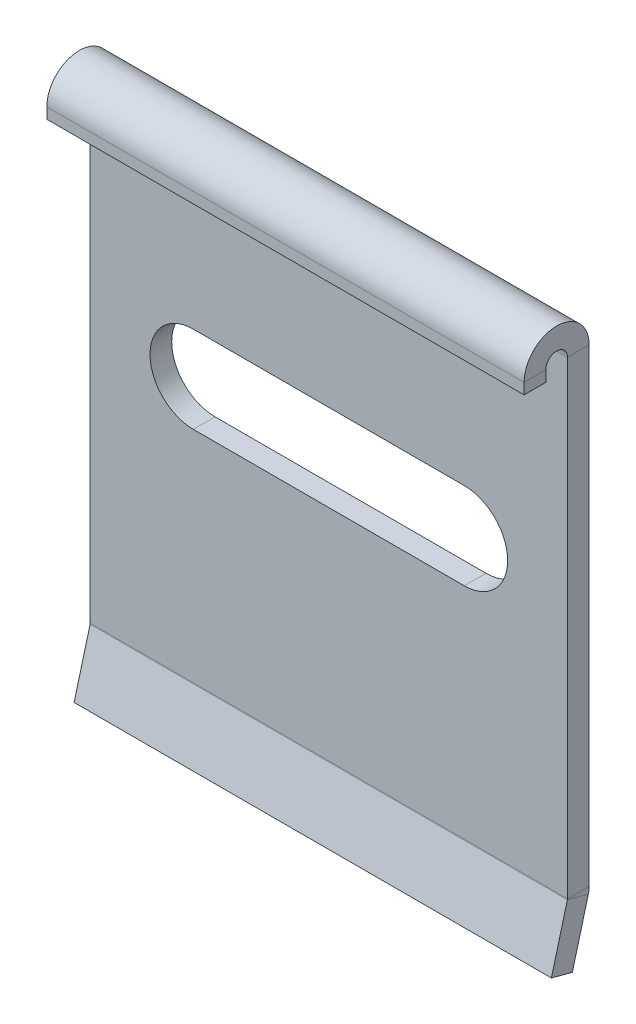
ISO-10303-21;
HEADER;
FILE_DESCRIPTION(('STEP AP214'),'2;1');
FILE_NAME('part.step','',(''),(''),'','','');
FILE_SCHEMA(('AUTOMOTIVE_DESIGN { 1 0 10303 214 1 1 1 1 }'));
ENDSEC;
DATA;
#1=APPLICATION_CONTEXT('core data for automotive mechanical design processes');
#2=APPLICATION_PROTOCOL_DEFINITION('international standard','automotive_design',2000,#1);
#3=PRODUCT_CONTEXT('',#1,'mechanical');
#4=PRODUCT('Part','Part','',(#3));
#5=PRODUCT_RELATED_PRODUCT_CATEGORY('part','',(#4));
#6=PRODUCT_DEFINITION_FORMATION('','',#4);
#7=PRODUCT_DEFINITION_CONTEXT('part definition',#1,'design');
#8=PRODUCT_DEFINITION('design','',#6,#7);
#9=PRODUCT_DEFINITION_SHAPE('','',#8);
#10=(LENGTH_UNIT() NAMED_UNIT(*) SI_UNIT(.MILLI.,.METRE.));
#11=(NAMED_UNIT(*) PLANE_ANGLE_UNIT() SI_UNIT($,.RADIAN.));
#12=(NAMED_UNIT(*) SI_UNIT($,.STERADIAN.) SOLID_ANGLE_UNIT());
#13=UNCERTAINTY_MEASURE_WITH_UNIT(LENGTH_MEASURE(1.E-05),#10,'distance_accuracy_value','');
#14=(GEOMETRIC_REPRESENTATION_CONTEXT(3) GLOBAL_UNCERTAINTY_ASSIGNED_CONTEXT((#13)) GLOBAL_UNIT_ASSIGNED_CONTEXT((#10,
#11,#12)) REPRESENTATION_CONTEXT('',''));
#15=CARTESIAN_POINT('',(0.,0.,0.));
#16=DIRECTION('',(0.,0.,1.));
#17=DIRECTION('',(1.,0.,0.));
#18=AXIS2_PLACEMENT_3D('',#15,#16,#17);
#19=CARTESIAN_POINT('',(33.3633633633633,45.4954954954955,-5.));
#20=DIRECTION('',(1.,0.,0.));
#21=DIRECTION('',(0.,1.,0.));
#22=AXIS2_PLACEMENT_3D('',#19,#20,#21);
#23=PLANE('',#22);
#24=DIRECTION('',(0.,1.,0.));
#25=VECTOR('',#24,1.);
#26=CARTESIAN_POINT('',(33.3633633633633,45.4954954954955,0.));
#27=LINE('',#26,#25);
#28=CARTESIAN_POINT('',(33.3633633633633,-70.0890127489998,0.));
#29=VERTEX_POINT('',#28);
#30=CARTESIAN_POINT('',(33.3633633633633,37.9954954954955,0.));
#31=VERTEX_POINT('',#30);
#32=EDGE_CURVE('E315',#29,#31,#27,.T.);
#33=ORIENTED_EDGE('',*,*,#32,.F.);
#34=DIRECTION('',(0.,0.,-1.));
#35=VECTOR('',#34,1.);
#36=CARTESIAN_POINT('',(33.3633633633633,-70.0890127489998,0.));
#37=LINE('',#36,#35);
#38=CARTESIAN_POINT('',(33.3633633633633,-70.0890127489998,-4.99999999999999));
#39=VERTEX_POINT('',#38);
#40=EDGE_CURVE('E225',#29,#39,#37,.T.);
#41=ORIENTED_EDGE('',*,*,#40,.T.);
#42=DIRECTION('',(0.,1.,0.));
#43=VECTOR('',#42,1.);
#44=CARTESIAN_POINT('',(33.3633633633633,45.4954954954955,-5.));
#45=LINE('',#44,#43);
#46=CARTESIAN_POINT('',(33.3633633633633,37.9954954954955,-5.));
#47=VERTEX_POINT('',#46);
#48=EDGE_CURVE('E64',#39,#47,#45,.T.);
#49=ORIENTED_EDGE('',*,*,#48,.T.);
#50=DIRECTION('',(0.,0.,-1.));
#51=VECTOR('',#50,1.);
#52=CARTESIAN_POINT('',(33.3633633633633,37.9954954954955,0.));
#53=LINE('',#52,#51);
#54=EDGE_CURVE('E251',#31,#47,#53,.T.);
#55=ORIENTED_EDGE('',*,*,#54,.F.);
#56=EDGE_LOOP('',(#33,#41,#49,#55));
#57=FACE_BOUND('',#56,.T.);
#58=ADVANCED_FACE('F56',(#57),#23,.T.);
#59=CARTESIAN_POINT('',(0.,0.,-5.));
#60=DIRECTION('',(0.,0.,-1.));
#61=DIRECTION('',(-1.,0.,0.));
#62=AXIS2_PLACEMENT_3D('',#59,#60,#61);
#63=PLANE('',#62);
#64=CARTESIAN_POINT('',(9.57957957957955,-9.5045045045045,-5.));
#65=DIRECTION('',(0.,0.,1.));
#66=DIRECTION('',(1.,0.,0.));
#67=AXIS2_PLACEMENT_3D('',#64,#65,#66);
#68=CIRCLE('',#67,9.99999999999999);
#69=CARTESIAN_POINT('',(9.57957957957956,-19.5045045045045,-5.));
#70=VERTEX_POINT('',#69);
#71=CARTESIAN_POINT('',(9.57957957957955,0.49549549549549,-5.));
#72=VERTEX_POINT('',#71);
#73=EDGE_CURVE('E290',#70,#72,#68,.T.);
#74=ORIENTED_EDGE('',*,*,#73,.T.);
#75=DIRECTION('',(-1.,0.,0.));
#76=VECTOR('',#75,1.);
#77=CARTESIAN_POINT('',(9.57957957957955,0.49549549549549,-5.));
#78=LINE('',#77,#76);
#79=CARTESIAN_POINT('',(-52.8528528528529,0.49549549549549,-5.));
#80=VERTEX_POINT('',#79);
#81=EDGE_CURVE('E293',#72,#80,#78,.T.);
#82=ORIENTED_EDGE('',*,*,#81,.T.);
#83=CARTESIAN_POINT('',(-52.8528528528529,-9.50450450450452,-5.));
#84=DIRECTION('',(0.,0.,1.));
#85=DIRECTION('',(1.,0.,0.));
#86=AXIS2_PLACEMENT_3D('',#83,#84,#85);
#87=CIRCLE('',#86,10.);
#88=CARTESIAN_POINT('',(-52.8528528528529,-19.5045045045045,-5.));
#89=VERTEX_POINT('',#88);
#90=EDGE_CURVE('E297',#80,#89,#87,.T.);
#91=ORIENTED_EDGE('',*,*,#90,.T.);
#92=DIRECTION('',(1.,0.,0.));
#93=VECTOR('',#92,1.);
#94=CARTESIAN_POINT('',(9.57957957957956,-19.5045045045045,-5.));
#95=LINE('',#94,#93);
#96=EDGE_CURVE('E300',#89,#70,#95,.T.);
#97=ORIENTED_EDGE('',*,*,#96,.T.);
#98=EDGE_LOOP('',(#74,#82,#91,#97));
#99=FACE_BOUND('',#98,.T.);
#100=ORIENTED_EDGE('',*,*,#48,.F.);
#101=DIRECTION('',(1.,0.,0.));
#102=VECTOR('',#101,1.);
#103=CARTESIAN_POINT('',(33.3633633633633,-70.0890127489998,-4.99999999999999));
#104=LINE('',#103,#102);
#105=CARTESIAN_POINT('',(-76.6366366366367,-70.0890127489998,-5.));
#106=VERTEX_POINT('',#105);
#107=EDGE_CURVE('E176',#39,#106,#104,.F.);
#108=ORIENTED_EDGE('',*,*,#107,.T.);
#109=DIRECTION('',(0.,-1.,0.));
#110=VECTOR('',#109,1.);
#111=CARTESIAN_POINT('',(-76.6366366366367,45.4954954954955,-5.));
#112=LINE('',#111,#110);
#113=CARTESIAN_POINT('',(-76.6366366366367,37.9954954954955,-5.));
#114=VERTEX_POINT('',#113);
#115=EDGE_CURVE('E13',#114,#106,#112,.T.);
#116=ORIENTED_EDGE('',*,*,#115,.F.);
#117=DIRECTION('',(-1.,0.,0.));
#118=VECTOR('',#117,1.);
#119=CARTESIAN_POINT('',(-76.6366366366367,37.9954954954955,-5.));
#120=LINE('',#119,#118);
#121=EDGE_CURVE('E235',#114,#47,#120,.F.);
#122=ORIENTED_EDGE('',*,*,#121,.T.);
#123=EDGE_LOOP('',(#100,#108,#116,#122));
#124=FACE_BOUND('',#123,.T.);
#125=ADVANCED_FACE('F338',(#99,#124),#63,.T.);
#126=CARTESIAN_POINT('',(0.,0.,0.));
#127=DIRECTION('',(0.,0.,-1.));
#128=DIRECTION('',(-1.,0.,0.));
#129=AXIS2_PLACEMENT_3D('',#126,#127,#128);
#130=PLANE('',#129);
#131=DIRECTION('',(-1.,0.,0.));
#132=VECTOR('',#131,1.);
#133=CARTESIAN_POINT('',(9.57957957957955,0.49549549549549,0.));
#134=LINE('',#133,#132);
#135=CARTESIAN_POINT('',(9.57957957957955,0.49549549549549,0.));
#136=VERTEX_POINT('',#135);
#137=CARTESIAN_POINT('',(-52.8528528528529,0.495495495495485,0.));
#138=VERTEX_POINT('',#137);
#139=EDGE_CURVE('E305',#136,#138,#134,.T.);
#140=ORIENTED_EDGE('',*,*,#139,.F.);
#141=CARTESIAN_POINT('',(9.57957957957955,-9.5045045045045,0.));
#142=DIRECTION('',(0.,0.,1.));
#143=DIRECTION('',(1.,0.,0.));
#144=AXIS2_PLACEMENT_3D('',#141,#142,#143);
#145=CIRCLE('',#144,9.99999999999999);
#146=CARTESIAN_POINT('',(9.57957957957956,-19.5045045045045,0.));
#147=VERTEX_POINT('',#146);
#148=EDGE_CURVE('E288',#147,#136,#145,.T.);
#149=ORIENTED_EDGE('',*,*,#148,.F.);
#150=DIRECTION('',(1.,0.,0.));
#151=VECTOR('',#150,1.);
#152=CARTESIAN_POINT('',(9.57957957957956,-19.5045045045045,0.));
#153=LINE('',#152,#151);
#154=CARTESIAN_POINT('',(-52.8528528528529,-19.5045045045045,0.));
#155=VERTEX_POINT('',#154);
#156=EDGE_CURVE('E294',#155,#147,#153,.T.);
#157=ORIENTED_EDGE('',*,*,#156,.F.);
#158=CARTESIAN_POINT('',(-52.8528528528529,-9.50450450450452,0.));
#159=DIRECTION('',(0.,0.,1.));
#160=DIRECTION('',(1.,0.,0.));
#161=AXIS2_PLACEMENT_3D('',#158,#159,#160);
#162=CIRCLE('',#161,10.);
#163=EDGE_CURVE('E308',#138,#155,#162,.T.);
#164=ORIENTED_EDGE('',*,*,#163,.F.);
#165=EDGE_LOOP('',(#140,#149,#157,#164));
#166=FACE_BOUND('',#165,.T.);
#167=DIRECTION('',(1.,0.,0.));
#168=VECTOR('',#167,1.);
#169=CARTESIAN_POINT('',(33.3633633633633,-70.0890127489998,0.));
#170=LINE('',#169,#168);
#171=CARTESIAN_POINT('',(-76.6366366366367,-70.0890127489998,0.));
#172=VERTEX_POINT('',#171);
#173=EDGE_CURVE('E229',#29,#172,#170,.F.);
#174=ORIENTED_EDGE('',*,*,#173,.F.);
#175=ORIENTED_EDGE('',*,*,#32,.T.);
#176=DIRECTION('',(-1.,0.,0.));
#177=VECTOR('',#176,1.);
#178=CARTESIAN_POINT('',(-76.6366366366367,37.9954954954955,0.));
#179=LINE('',#178,#177);
#180=CARTESIAN_POINT('',(-76.6366366366367,37.9954954954955,0.));
#181=VERTEX_POINT('',#180);
#182=EDGE_CURVE('E248',#181,#31,#179,.F.);
#183=ORIENTED_EDGE('',*,*,#182,.F.);
#184=DIRECTION('',(0.,-1.,0.));
#185=VECTOR('',#184,1.);
#186=CARTESIAN_POINT('',(-76.6366366366367,45.4954954954955,0.));
#187=LINE('',#186,#185);
#188=EDGE_CURVE('E59',#181,#172,#187,.T.);
#189=ORIENTED_EDGE('',*,*,#188,.T.);
#190=EDGE_LOOP('',(#174,#175,#183,#189));
#191=FACE_BOUND('',#190,.T.);
#192=ADVANCED_FACE('F329',(#166,#191),#130,.F.);
#193=CARTESIAN_POINT('',(-76.6366366366367,45.4954954954955,-5.));
#194=DIRECTION('',(-1.,0.,0.));
#195=DIRECTION('',(0.,-1.,0.));
#196=AXIS2_PLACEMENT_3D('',#193,#194,#195);
#197=PLANE('',#196);
#198=DIRECTION('',(0.,0.,-1.));
#199=VECTOR('',#198,1.);
#200=CARTESIAN_POINT('',(-76.6366366366367,-70.0890127489998,0.));
#201=LINE('',#200,#199);
#202=EDGE_CURVE('E232',#172,#106,#201,.T.);
#203=ORIENTED_EDGE('',*,*,#202,.F.);
#204=ORIENTED_EDGE('',*,*,#188,.F.);
#205=DIRECTION('',(0.,0.,-1.));
#206=VECTOR('',#205,1.);
#207=CARTESIAN_POINT('',(-76.6366366366367,37.9954954954955,0.));
#208=LINE('',#207,#206);
#209=EDGE_CURVE('E242',#181,#114,#208,.T.);
#210=ORIENTED_EDGE('',*,*,#209,.T.);
#211=ORIENTED_EDGE('',*,*,#115,.T.);
#212=EDGE_LOOP('',(#203,#204,#210,#211));
#213=FACE_BOUND('',#212,.T.);
#214=ADVANCED_FACE('F331',(#213),#197,.T.);
#215=CARTESIAN_POINT('',(9.57957957957955,-9.5045045045045,-5.));
#216=DIRECTION('',(0.,0.,1.));
#217=DIRECTION('',(1.,0.,0.));
#218=AXIS2_PLACEMENT_3D('',#215,#216,#217);
#219=CYLINDRICAL_SURFACE('',#218,9.99999999999999);
#220=ORIENTED_EDGE('',*,*,#148,.T.);
#221=DIRECTION('',(0.,0.,1.));
#222=VECTOR('',#221,1.);
#223=CARTESIAN_POINT('',(9.57957957957955,0.49549549549549,-5.));
#224=LINE('',#223,#222);
#225=EDGE_CURVE('E303',#72,#136,#224,.T.);
#226=ORIENTED_EDGE('',*,*,#225,.F.);
#227=ORIENTED_EDGE('',*,*,#73,.F.);
#228=DIRECTION('',(0.,0.,1.));
#229=VECTOR('',#228,1.);
#230=CARTESIAN_POINT('',(9.57957957957956,-19.5045045045045,-5.));
#231=LINE('',#230,#229);
#232=EDGE_CURVE('E313',#70,#147,#231,.T.);
#233=ORIENTED_EDGE('',*,*,#232,.T.);
#234=EDGE_LOOP('',(#220,#226,#227,#233));
#235=FACE_BOUND('',#234,.T.);
#236=ADVANCED_FACE('F381',(#235),#219,.F.);
#237=CARTESIAN_POINT('',(9.57957957957956,-19.5045045045045,-5.));
#238=DIRECTION('',(0.,-1.,0.));
#239=DIRECTION('',(1.,0.,0.));
#240=AXIS2_PLACEMENT_3D('',#237,#238,#239);
#241=PLANE('',#240);
#242=ORIENTED_EDGE('',*,*,#156,.T.);
#243=ORIENTED_EDGE('',*,*,#232,.F.);
#244=ORIENTED_EDGE('',*,*,#96,.F.);
#245=DIRECTION('',(0.,0.,1.));
#246=VECTOR('',#245,1.);
#247=CARTESIAN_POINT('',(-52.8528528528529,-19.5045045045045,-5.));
#248=LINE('',#247,#246);
#249=EDGE_CURVE('E316',#89,#155,#248,.T.);
#250=ORIENTED_EDGE('',*,*,#249,.T.);
#251=EDGE_LOOP('',(#242,#243,#244,#250));
#252=FACE_BOUND('',#251,.T.);
#253=ADVANCED_FACE('F387',(#252),#241,.F.);
#254=CARTESIAN_POINT('',(-52.8528528528529,-9.50450450450452,-5.));
#255=DIRECTION('',(0.,0.,1.));
#256=DIRECTION('',(1.,0.,0.));
#257=AXIS2_PLACEMENT_3D('',#254,#255,#256);
#258=CYLINDRICAL_SURFACE('',#257,10.);
#259=ORIENTED_EDGE('',*,*,#163,.T.);
#260=ORIENTED_EDGE('',*,*,#249,.F.);
#261=ORIENTED_EDGE('',*,*,#90,.F.);
#262=DIRECTION('',(0.,0.,1.));
#263=VECTOR('',#262,1.);
#264=CARTESIAN_POINT('',(-52.8528528528529,0.495495495495485,-5.));
#265=LINE('',#264,#263);
#266=EDGE_CURVE('E318',#80,#138,#265,.T.);
#267=ORIENTED_EDGE('',*,*,#266,.T.);
#268=EDGE_LOOP('',(#259,#260,#261,#267));
#269=FACE_BOUND('',#268,.T.);
#270=ADVANCED_FACE('F392',(#269),#258,.F.);
#271=CARTESIAN_POINT('',(9.57957957957955,0.49549549549549,-5.));
#272=DIRECTION('',(0.,1.,0.));
#273=DIRECTION('',(0.,0.,1.));
#274=AXIS2_PLACEMENT_3D('',#271,#272,#273);
#275=PLANE('',#274);
#276=ORIENTED_EDGE('',*,*,#139,.T.);
#277=ORIENTED_EDGE('',*,*,#266,.F.);
#278=ORIENTED_EDGE('',*,*,#81,.F.);
#279=ORIENTED_EDGE('',*,*,#225,.T.);
#280=EDGE_LOOP('',(#276,#277,#278,#279));
#281=FACE_BOUND('',#280,.T.);
#282=ADVANCED_FACE('F401',(#281),#275,.F.);
#283=CARTESIAN_POINT('',(-76.6366366366367,36.7454954954955,10.));
#284=DIRECTION('',(1.,0.,0.));
#285=DIRECTION('',(0.,1.,0.));
#286=AXIS2_PLACEMENT_3D('',#283,#284,#285);
#287=PLANE('',#286);
#288=DIRECTION('',(0.,0.,1.));
#289=VECTOR('',#288,1.);
#290=CARTESIAN_POINT('',(-76.6366366366367,37.9954954954955,10.));
#291=LINE('',#290,#289);
#292=CARTESIAN_POINT('',(-76.6366366366367,37.9954954954955,5.));
#293=VERTEX_POINT('',#292);
#294=CARTESIAN_POINT('',(-76.6366366366367,37.9954954954955,10.));
#295=VERTEX_POINT('',#294);
#296=EDGE_CURVE('E282',#293,#295,#291,.T.);
#297=ORIENTED_EDGE('',*,*,#296,.F.);
#298=DIRECTION('',(0.,1.,0.));
#299=VECTOR('',#298,1.);
#300=CARTESIAN_POINT('',(-76.6366366366367,36.7454954954955,5.));
#301=LINE('',#300,#299);
#302=CARTESIAN_POINT('',(-76.6366366366367,35.4954954954955,5.));
#303=VERTEX_POINT('',#302);
#304=EDGE_CURVE('E273',#303,#293,#301,.T.);
#305=ORIENTED_EDGE('',*,*,#304,.F.);
#306=DIRECTION('',(0.,0.,1.));
#307=VECTOR('',#306,1.);
#308=CARTESIAN_POINT('',(-76.6366366366367,35.4954954954955,10.));
#309=LINE('',#308,#307);
#310=CARTESIAN_POINT('',(-76.6366366366367,35.4954954954955,10.));
#311=VERTEX_POINT('',#310);
#312=EDGE_CURVE('E280',#303,#311,#309,.T.);
#313=ORIENTED_EDGE('',*,*,#312,.T.);
#314=DIRECTION('',(0.,1.,0.));
#315=VECTOR('',#314,1.);
#316=CARTESIAN_POINT('',(-76.6366366366367,36.7454954954955,10.));
#317=LINE('',#316,#315);
#318=EDGE_CURVE('E261',#311,#295,#317,.T.);
#319=ORIENTED_EDGE('',*,*,#318,.T.);
#320=EDGE_LOOP('',(#297,#305,#313,#319));
#321=FACE_BOUND('',#320,.T.);
#322=ADVANCED_FACE('F354',(#321),#287,.F.);
#323=CARTESIAN_POINT('',(-21.6366366366367,35.4954954954955,10.));
#324=DIRECTION('',(0.,1.,0.));
#325=DIRECTION('',(-1.,0.,0.));
#326=AXIS2_PLACEMENT_3D('',#323,#324,#325);
#327=PLANE('',#326);
#328=ORIENTED_EDGE('',*,*,#312,.F.);
#329=DIRECTION('',(1.,0.,0.));
#330=VECTOR('',#329,1.);
#331=CARTESIAN_POINT('',(-21.6366366366367,35.4954954954955,5.));
#332=LINE('',#331,#330);
#333=CARTESIAN_POINT('',(33.3633633633633,35.4954954954955,5.));
#334=VERTEX_POINT('',#333);
#335=EDGE_CURVE('E270',#334,#303,#332,.F.);
#336=ORIENTED_EDGE('',*,*,#335,.F.);
#337=DIRECTION('',(0.,0.,1.));
#338=VECTOR('',#337,1.);
#339=CARTESIAN_POINT('',(33.3633633633633,35.4954954954955,10.));
#340=LINE('',#339,#338);
#341=CARTESIAN_POINT('',(33.3633633633633,35.4954954954955,10.));
#342=VERTEX_POINT('',#341);
#343=EDGE_CURVE('E260',#334,#342,#340,.T.);
#344=ORIENTED_EDGE('',*,*,#343,.T.);
#345=DIRECTION('',(-1.,0.,0.));
#346=VECTOR('',#345,1.);
#347=CARTESIAN_POINT('',(-21.6366366366367,35.4954954954955,10.));
#348=LINE('',#347,#346);
#349=EDGE_CURVE('E257',#342,#311,#348,.T.);
#350=ORIENTED_EDGE('',*,*,#349,.T.);
#351=EDGE_LOOP('',(#328,#336,#344,#350));
#352=FACE_BOUND('',#351,.T.);
#353=ADVANCED_FACE('F415',(#352),#327,.F.);
#354=CARTESIAN_POINT('',(33.3633633633633,36.7454954954955,10.));
#355=DIRECTION('',(-1.,0.,0.));
#356=DIRECTION('',(0.,-1.,0.));
#357=AXIS2_PLACEMENT_3D('',#354,#355,#356);
#358=PLANE('',#357);
#359=DIRECTION('',(0.,1.,0.));
#360=VECTOR('',#359,1.);
#361=CARTESIAN_POINT('',(33.3633633633633,36.7454954954955,5.));
#362=LINE('',#361,#360);
#363=CARTESIAN_POINT('',(33.3633633633633,37.9954954954955,5.));
#364=VERTEX_POINT('',#363);
#365=EDGE_CURVE('E254',#364,#334,#362,.F.);
#366=ORIENTED_EDGE('',*,*,#365,.F.);
#367=DIRECTION('',(0.,0.,1.));
#368=VECTOR('',#367,1.);
#369=CARTESIAN_POINT('',(33.3633633633633,37.9954954954955,10.));
#370=LINE('',#369,#368);
#371=CARTESIAN_POINT('',(33.3633633633633,37.9954954954955,10.));
#372=VERTEX_POINT('',#371);
#373=EDGE_CURVE('E285',#364,#372,#370,.T.);
#374=ORIENTED_EDGE('',*,*,#373,.T.);
#375=DIRECTION('',(0.,-1.,0.));
#376=VECTOR('',#375,1.);
#377=CARTESIAN_POINT('',(33.3633633633633,36.7454954954955,10.));
#378=LINE('',#377,#376);
#379=EDGE_CURVE('E267',#372,#342,#378,.T.);
#380=ORIENTED_EDGE('',*,*,#379,.T.);
#381=ORIENTED_EDGE('',*,*,#343,.F.);
#382=EDGE_LOOP('',(#366,#374,#380,#381));
#383=FACE_BOUND('',#382,.T.);
#384=ADVANCED_FACE('F412',(#383),#358,.F.);
#385=CARTESIAN_POINT('',(-21.6366366366367,36.7454954954955,10.));
#386=DIRECTION('',(0.,0.,1.));
#387=DIRECTION('',(1.,0.,0.));
#388=AXIS2_PLACEMENT_3D('',#385,#386,#387);
#389=PLANE('',#388);
#390=ORIENTED_EDGE('',*,*,#349,.F.);
#391=ORIENTED_EDGE('',*,*,#379,.F.);
#392=DIRECTION('',(1.,0.,0.));
#393=VECTOR('',#392,1.);
#394=CARTESIAN_POINT('',(-21.6366366366367,37.9954954954955,10.));
#395=LINE('',#394,#393);
#396=EDGE_CURVE('E264',#295,#372,#395,.T.);
#397=ORIENTED_EDGE('',*,*,#396,.F.);
#398=ORIENTED_EDGE('',*,*,#318,.F.);
#399=EDGE_LOOP('',(#390,#391,#397,#398));
#400=FACE_BOUND('',#399,.T.);
#401=ADVANCED_FACE('F352',(#400),#389,.T.);
#402=CARTESIAN_POINT('',(-21.6366366366367,36.7454954954955,5.));
#403=DIRECTION('',(0.,0.,1.));
#404=DIRECTION('',(1.,0.,0.));
#405=AXIS2_PLACEMENT_3D('',#402,#403,#404);
#406=PLANE('',#405);
#407=ORIENTED_EDGE('',*,*,#335,.T.);
#408=ORIENTED_EDGE('',*,*,#304,.T.);
#409=DIRECTION('',(1.,0.,0.));
#410=VECTOR('',#409,1.);
#411=CARTESIAN_POINT('',(-21.6366366366367,37.9954954954955,5.));
#412=LINE('',#411,#410);
#413=EDGE_CURVE('E276',#293,#364,#412,.T.);
#414=ORIENTED_EDGE('',*,*,#413,.T.);
#415=ORIENTED_EDGE('',*,*,#365,.T.);
#416=EDGE_LOOP('',(#407,#408,#414,#415));
#417=FACE_BOUND('',#416,.T.);
#418=ADVANCED_FACE('F366',(#417),#406,.F.);
#419=CARTESIAN_POINT('',(33.3633633633633,37.9954954954955,2.5));
#420=DIRECTION('',(1.,0.,0.));
#421=DIRECTION('',(0.,0.,-1.));
#422=AXIS2_PLACEMENT_3D('',#419,#420,#421);
#423=PLANE('',#422);
#424=ORIENTED_EDGE('',*,*,#373,.F.);
#425=CARTESIAN_POINT('',(33.3633633633633,37.9954954954955,2.5));
#426=DIRECTION('',(-1.,0.,0.));
#427=DIRECTION('',(0.,0.,1.));
#428=AXIS2_PLACEMENT_3D('',#425,#426,#427);
#429=CIRCLE('',#428,2.5);
#430=EDGE_CURVE('E245',#31,#364,#429,.F.);
#431=ORIENTED_EDGE('',*,*,#430,.F.);
#432=ORIENTED_EDGE('',*,*,#54,.T.);
#433=CARTESIAN_POINT('',(33.3633633633633,37.9954954954955,2.5));
#434=DIRECTION('',(-1.,0.,0.));
#435=DIRECTION('',(0.,0.,1.));
#436=AXIS2_PLACEMENT_3D('',#433,#434,#435);
#437=CIRCLE('',#436,7.5);
#438=EDGE_CURVE('E238',#47,#372,#437,.F.);
#439=ORIENTED_EDGE('',*,*,#438,.T.);
#440=EDGE_LOOP('',(#424,#431,#432,#439));
#441=FACE_BOUND('',#440,.T.);
#442=ADVANCED_FACE('F345',(#441),#423,.T.);
#443=CARTESIAN_POINT('',(-76.6366366366367,37.9954954954955,2.5));
#444=DIRECTION('',(1.,0.,0.));
#445=DIRECTION('',(0.,0.,-1.));
#446=AXIS2_PLACEMENT_3D('',#443,#444,#445);
#447=PLANE('',#446);
#448=CARTESIAN_POINT('',(-76.6366366366367,37.9954954954955,2.5));
#449=DIRECTION('',(-1.,0.,0.));
#450=DIRECTION('',(0.,0.,1.));
#451=AXIS2_PLACEMENT_3D('',#448,#449,#450);
#452=CIRCLE('',#451,2.5);
#453=EDGE_CURVE('E80',#293,#181,#452,.T.);
#454=ORIENTED_EDGE('',*,*,#453,.F.);
#455=ORIENTED_EDGE('',*,*,#296,.T.);
#456=CARTESIAN_POINT('',(-76.6366366366367,37.9954954954955,2.5));
#457=DIRECTION('',(-1.,0.,0.));
#458=DIRECTION('',(0.,0.,1.));
#459=AXIS2_PLACEMENT_3D('',#456,#457,#458);
#460=CIRCLE('',#459,7.5);
#461=EDGE_CURVE('E239',#295,#114,#460,.T.);
#462=ORIENTED_EDGE('',*,*,#461,.T.);
#463=ORIENTED_EDGE('',*,*,#209,.F.);
#464=EDGE_LOOP('',(#454,#455,#462,#463));
#465=FACE_BOUND('',#464,.T.);
#466=ADVANCED_FACE('F357',(#465),#447,.F.);
#467=CARTESIAN_POINT('',(-76.6366366366367,37.9954954954955,2.5));
#468=DIRECTION('',(-1.,0.,0.));
#469=DIRECTION('',(0.,0.,1.));
#470=AXIS2_PLACEMENT_3D('',#467,#468,#469);
#471=CYLINDRICAL_SURFACE('',#470,7.5);
#472=ORIENTED_EDGE('',*,*,#121,.F.);
#473=ORIENTED_EDGE('',*,*,#461,.F.);
#474=ORIENTED_EDGE('',*,*,#396,.T.);
#475=ORIENTED_EDGE('',*,*,#438,.F.);
#476=EDGE_LOOP('',(#472,#473,#474,#475));
#477=FACE_BOUND('',#476,.T.);
#478=ADVANCED_FACE('F347',(#477),#471,.T.);
#479=CARTESIAN_POINT('',(-76.6366366366367,37.9954954954955,2.5));
#480=DIRECTION('',(-1.,0.,0.));
#481=DIRECTION('',(0.,0.,1.));
#482=AXIS2_PLACEMENT_3D('',#479,#480,#481);
#483=CYLINDRICAL_SURFACE('',#482,2.5);
#484=ORIENTED_EDGE('',*,*,#182,.T.);
#485=ORIENTED_EDGE('',*,*,#430,.T.);
#486=ORIENTED_EDGE('',*,*,#413,.F.);
#487=ORIENTED_EDGE('',*,*,#453,.T.);
#488=EDGE_LOOP('',(#484,#485,#486,#487));
#489=FACE_BOUND('',#488,.T.);
#490=ADVANCED_FACE('F364',(#489),#483,.F.);
#491=CARTESIAN_POINT('',(-76.6366366366367,-70.0890127489998,0.736600000000026));
#492=DIRECTION('',(-1.,0.,0.));
#493=DIRECTION('',(0.,0.,1.));
#494=AXIS2_PLACEMENT_3D('',#491,#492,#493);
#495=PLANE('',#494);
#496=DIRECTION('',(0.,-0.258819045102515,-0.96592582628907));
#497=VECTOR('',#496,1.);
#498=CARTESIAN_POINT('',(-76.6366366366367,-71.5737540831349,-4.80453009508987));
#499=LINE('',#498,#497);
#500=CARTESIAN_POINT('',(-76.6366366366367,-70.2796588576224,0.0250990363554814));
#501=VERTEX_POINT('',#500);
#502=CARTESIAN_POINT('',(-76.6366366366367,-71.5737540831349,-4.80453009508987));
#503=VERTEX_POINT('',#502);
#504=EDGE_CURVE('E221',#501,#503,#499,.T.);
#505=ORIENTED_EDGE('',*,*,#504,.F.);
#506=CARTESIAN_POINT('',(-76.6366366366367,-70.0890127489998,0.736600000000026));
#507=DIRECTION('',(1.,0.,0.));
#508=DIRECTION('',(0.,0.,-1.));
#509=AXIS2_PLACEMENT_3D('',#506,#507,#508);
#510=CIRCLE('',#509,0.736600000000016);
#511=EDGE_CURVE('E179',#172,#501,#510,.F.);
#512=ORIENTED_EDGE('',*,*,#511,.F.);
#513=ORIENTED_EDGE('',*,*,#202,.T.);
#514=CARTESIAN_POINT('',(-76.6366366366367,-70.0890127489998,0.736600000000026));
#515=DIRECTION('',(1.,0.,0.));
#516=DIRECTION('',(0.,0.,-1.));
#517=AXIS2_PLACEMENT_3D('',#514,#515,#516);
#518=CIRCLE('',#517,5.73660000000002);
#519=EDGE_CURVE('E72',#106,#503,#518,.F.);
#520=ORIENTED_EDGE('',*,*,#519,.T.);
#521=EDGE_LOOP('',(#505,#512,#513,#520));
#522=FACE_BOUND('',#521,.T.);
#523=ADVANCED_FACE('F335',(#522),#495,.T.);
#524=CARTESIAN_POINT('',(33.3633633633633,-70.0890127489998,0.736600000000026));
#525=DIRECTION('',(-1.,0.,0.));
#526=DIRECTION('',(0.,0.,1.));
#527=AXIS2_PLACEMENT_3D('',#524,#525,#526);
#528=PLANE('',#527);
#529=CARTESIAN_POINT('',(33.3633633633633,-70.0890127489998,0.736600000000026));
#530=DIRECTION('',(1.,0.,0.));
#531=DIRECTION('',(0.,0.,-1.));
#532=AXIS2_PLACEMENT_3D('',#529,#530,#531);
#533=CIRCLE('',#532,0.736600000000016);
#534=CARTESIAN_POINT('',(33.3633633633633,-70.2796588576224,0.0250990363554814));
#535=VERTEX_POINT('',#534);
#536=EDGE_CURVE('E186',#535,#29,#533,.T.);
#537=ORIENTED_EDGE('',*,*,#536,.F.);
#538=DIRECTION('',(0.,-0.258819045102515,-0.96592582628907));
#539=VECTOR('',#538,1.);
#540=CARTESIAN_POINT('',(33.3633633633633,-70.2796588576224,0.0250990363554714));
#541=LINE('',#540,#539);
#542=CARTESIAN_POINT('',(33.3633633633633,-71.5737540831349,-4.80453009508987));
#543=VERTEX_POINT('',#542);
#544=EDGE_CURVE('E183',#535,#543,#541,.T.);
#545=ORIENTED_EDGE('',*,*,#544,.T.);
#546=CARTESIAN_POINT('',(33.3633633633633,-70.0890127489998,0.736600000000026));
#547=DIRECTION('',(1.,0.,0.));
#548=DIRECTION('',(0.,0.,-1.));
#549=AXIS2_PLACEMENT_3D('',#546,#547,#548);
#550=CIRCLE('',#549,5.73660000000002);
#551=EDGE_CURVE('E170',#543,#39,#550,.T.);
#552=ORIENTED_EDGE('',*,*,#551,.T.);
#553=ORIENTED_EDGE('',*,*,#40,.F.);
#554=EDGE_LOOP('',(#537,#545,#552,#553));
#555=FACE_BOUND('',#554,.T.);
#556=ADVANCED_FACE('F184',(#555),#528,.F.);
#557=CARTESIAN_POINT('',(33.3633633633633,-70.0890127489998,0.736600000000026));
#558=DIRECTION('',(1.,0.,0.));
#559=DIRECTION('',(0.,-0.258819045102515,-0.96592582628907));
#560=AXIS2_PLACEMENT_3D('',#557,#558,#559);
#561=CYLINDRICAL_SURFACE('',#560,5.73660000000002);
#562=ORIENTED_EDGE('',*,*,#107,.F.);
#563=ORIENTED_EDGE('',*,*,#551,.F.);
#564=DIRECTION('',(1.,0.,0.));
#565=VECTOR('',#564,1.);
#566=CARTESIAN_POINT('',(0.,-71.5737540831349,-4.80453009508987));
#567=LINE('',#566,#565);
#568=EDGE_CURVE('E174',#503,#543,#567,.T.);
#569=ORIENTED_EDGE('',*,*,#568,.F.);
#570=ORIENTED_EDGE('',*,*,#519,.F.);
#571=EDGE_LOOP('',(#562,#563,#569,#570));
#572=FACE_BOUND('',#571,.T.);
#573=ADVANCED_FACE('F172',(#572),#561,.T.);
#574=CARTESIAN_POINT('',(33.3633633633633,-70.0890127489998,0.736600000000026));
#575=DIRECTION('',(1.,0.,0.));
#576=DIRECTION('',(0.,-0.258819045102515,-0.96592582628907));
#577=AXIS2_PLACEMENT_3D('',#574,#575,#576);
#578=CYLINDRICAL_SURFACE('',#577,0.736600000000016);
#579=ORIENTED_EDGE('',*,*,#173,.T.);
#580=ORIENTED_EDGE('',*,*,#511,.T.);
#581=DIRECTION('',(-1.,0.,0.));
#582=VECTOR('',#581,1.);
#583=CARTESIAN_POINT('',(-76.6366366366367,-70.2796588576224,0.0250990363554814));
#584=LINE('',#583,#582);
#585=EDGE_CURVE('E191',#501,#535,#584,.F.);
#586=ORIENTED_EDGE('',*,*,#585,.T.);
#587=ORIENTED_EDGE('',*,*,#536,.T.);
#588=EDGE_LOOP('',(#579,#580,#586,#587));
#589=FACE_BOUND('',#588,.T.);
#590=ADVANCED_FACE('F506',(#589),#578,.F.);
#591=CARTESIAN_POINT('',(33.3633633633633,-71.4800832042353,-4.82962913144535));
#592=DIRECTION('',(1.,0.,0.));
#593=DIRECTION('',(0.,1.,0.));
#594=AXIS2_PLACEMENT_3D('',#591,#592,#593);
#595=PLANE('',#594);
#596=DIRECTION('',(0.,0.96592582628907,-0.258819045102515));
#597=VECTOR('',#596,1.);
#598=CARTESIAN_POINT('',(33.3633633633633,-71.4800832042353,-4.82962913144535));
#599=LINE('',#598,#597);
#600=CARTESIAN_POINT('',(33.3633633633634,-85.3331378609957,-1.11771432346228));
#601=VERTEX_POINT('',#600);
#602=EDGE_CURVE('E198',#601,#543,#599,.T.);
#603=ORIENTED_EDGE('',*,*,#602,.T.);
#604=ORIENTED_EDGE('',*,*,#544,.F.);
#605=DIRECTION('',(0.,-0.96592582628907,0.258819045102515));
#606=VECTOR('',#605,1.);
#607=CARTESIAN_POINT('',(33.3633633633633,13.3228516005497,-22.3761261261256));
#608=LINE('',#607,#606);
#609=CARTESIAN_POINT('',(33.3633633633633,-84.0390426354831,3.71191480798308));
#610=VERTEX_POINT('',#609);
#611=EDGE_CURVE('E214',#610,#535,#608,.F.);
#612=ORIENTED_EDGE('',*,*,#611,.F.);
#613=DIRECTION('',(0.,0.258819045102515,0.96592582628907));
#614=VECTOR('',#613,1.);
#615=CARTESIAN_POINT('',(33.3633633633634,-85.3331378609957,-1.11771432346228));
#616=LINE('',#615,#614);
#617=EDGE_CURVE('E203',#601,#610,#616,.T.);
#618=ORIENTED_EDGE('',*,*,#617,.F.);
#619=EDGE_LOOP('',(#603,#604,#612,#618));
#620=FACE_BOUND('',#619,.T.);
#621=ADVANCED_FACE('F202',(#620),#595,.T.);
#622=CARTESIAN_POINT('',(-76.6366366366367,-85.3331378609957,-1.11771432346228));
#623=DIRECTION('',(-1.,0.,0.));
#624=DIRECTION('',(0.,-1.,0.));
#625=AXIS2_PLACEMENT_3D('',#622,#623,#624);
#626=PLANE('',#625);
#627=DIRECTION('',(0.,0.96592582628907,-0.258819045102515));
#628=VECTOR('',#627,1.);
#629=CARTESIAN_POINT('',(-76.6366366366366,13.3228516005497,-22.3761261261256));
#630=LINE('',#629,#628);
#631=CARTESIAN_POINT('',(-76.6366366366367,-84.0390426354831,3.71191480798307));
#632=VERTEX_POINT('',#631);
#633=EDGE_CURVE('E200',#501,#632,#630,.F.);
#634=ORIENTED_EDGE('',*,*,#633,.F.);
#635=ORIENTED_EDGE('',*,*,#504,.T.);
#636=DIRECTION('',(0.,-0.96592582628907,0.258819045102515));
#637=VECTOR('',#636,1.);
#638=CARTESIAN_POINT('',(-76.6366366366367,-85.3331378609957,-1.11771432346228));
#639=LINE('',#638,#637);
#640=CARTESIAN_POINT('',(-76.6366366366367,-85.3331378609957,-1.11771432346228));
#641=VERTEX_POINT('',#640);
#642=EDGE_CURVE('E199',#503,#641,#639,.T.);
#643=ORIENTED_EDGE('',*,*,#642,.T.);
#644=DIRECTION('',(0.,0.258819045102515,0.96592582628907));
#645=VECTOR('',#644,1.);
#646=CARTESIAN_POINT('',(-76.6366366366367,-85.3331378609957,-1.11771432346228));
#647=LINE('',#646,#645);
#648=EDGE_CURVE('E205',#641,#632,#647,.T.);
#649=ORIENTED_EDGE('',*,*,#648,.T.);
#650=EDGE_LOOP('',(#634,#635,#643,#649));
#651=FACE_BOUND('',#650,.T.);
#652=ADVANCED_FACE('F526',(#651),#626,.T.);
#653=CARTESIAN_POINT('',(0.,12.0287563750371,-27.205755257571));
#654=DIRECTION('',(0.,-0.258819045102515,-0.96592582628907));
#655=DIRECTION('',(0.,0.96592582628907,-0.258819045102515));
#656=AXIS2_PLACEMENT_3D('',#653,#654,#655);
#657=PLANE('',#656);
#658=ORIENTED_EDGE('',*,*,#642,.F.);
#659=ORIENTED_EDGE('',*,*,#568,.T.);
#660=ORIENTED_EDGE('',*,*,#602,.F.);
#661=DIRECTION('',(1.,0.,0.));
#662=VECTOR('',#661,1.);
#663=CARTESIAN_POINT('',(33.3633633633634,-85.3331378609957,-1.11771432346228));
#664=LINE('',#663,#662);
#665=EDGE_CURVE('E206',#641,#601,#664,.T.);
#666=ORIENTED_EDGE('',*,*,#665,.F.);
#667=EDGE_LOOP('',(#658,#659,#660,#666));
#668=FACE_BOUND('',#667,.T.);
#669=ADVANCED_FACE('F196',(#668),#657,.T.);
#670=CARTESIAN_POINT('',(0.,13.3228516005497,-22.3761261261256));
#671=DIRECTION('',(0.,-0.258819045102515,-0.96592582628907));
#672=DIRECTION('',(0.,0.96592582628907,-0.258819045102515));
#673=AXIS2_PLACEMENT_3D('',#670,#671,#672);
#674=PLANE('',#673);
#675=ORIENTED_EDGE('',*,*,#585,.F.);
#676=ORIENTED_EDGE('',*,*,#633,.T.);
#677=DIRECTION('',(-1.,0.,0.));
#678=VECTOR('',#677,1.);
#679=CARTESIAN_POINT('',(0.,-84.0390426354831,3.71191480798307));
#680=LINE('',#679,#678);
#681=EDGE_CURVE('E216',#632,#610,#680,.F.);
#682=ORIENTED_EDGE('',*,*,#681,.T.);
#683=ORIENTED_EDGE('',*,*,#611,.T.);
#684=EDGE_LOOP('',(#675,#676,#682,#683));
#685=FACE_BOUND('',#684,.T.);
#686=ADVANCED_FACE('F546',(#685),#674,.F.);
#687=CARTESIAN_POINT('',(33.3633633633634,-85.3331378609957,-1.11771432346228));
#688=DIRECTION('',(0.,-0.96592582628907,0.258819045102515));
#689=DIRECTION('',(0.,-0.258819045102515,-0.96592582628907));
#690=AXIS2_PLACEMENT_3D('',#687,#688,#689);
#691=PLANE('',#690);
#692=ORIENTED_EDGE('',*,*,#681,.F.);
#693=ORIENTED_EDGE('',*,*,#648,.F.);
#694=ORIENTED_EDGE('',*,*,#665,.T.);
#695=ORIENTED_EDGE('',*,*,#617,.T.);
#696=EDGE_LOOP('',(#692,#693,#694,#695));
#697=FACE_BOUND('',#696,.T.);
#698=ADVANCED_FACE('F556',(#697),#691,.T.);
#699=CLOSED_SHELL('',(#58,#125,#192,#214,#236,#253,#270,#282,#322,#353,#384,#401,#418,#442,#466,
#478,#490,#523,#556,#573,#590,#621,#652,#669,#686,#698));
#700=MANIFOLD_SOLID_BREP('B2',#699);
#701=ADVANCED_BREP_SHAPE_REPRESENTATION('',(#18,#700),#14);
#702=SHAPE_DEFINITION_REPRESENTATION(#9,#701);
ENDSEC;
END-ISO-10303-21;
